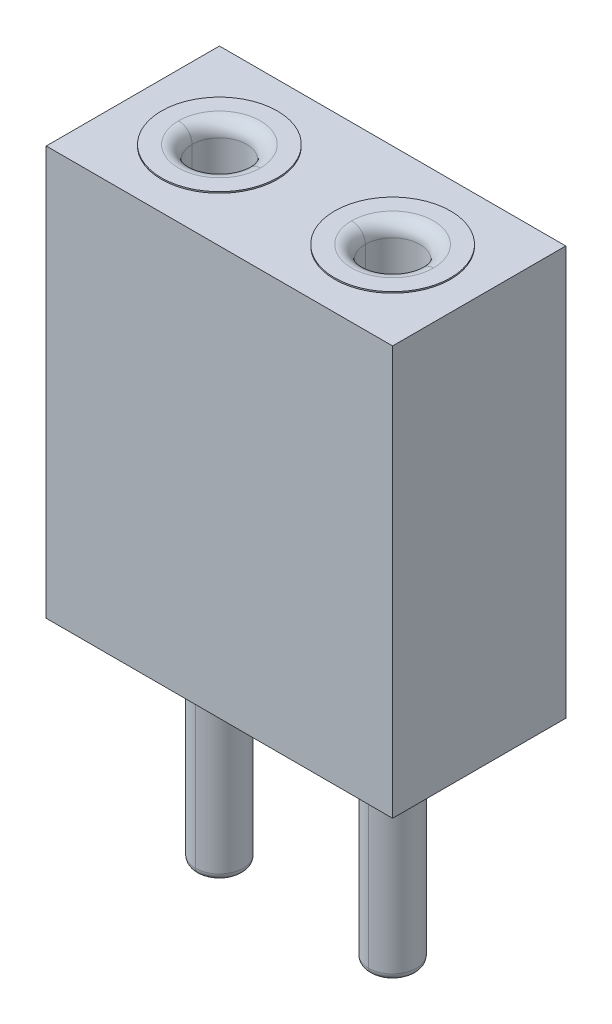
ISO-10303-21;
HEADER;
FILE_DESCRIPTION(('STEP AP214'),'2;1');
FILE_NAME('part.step','',(''),(''),'','','');
FILE_SCHEMA(('AUTOMOTIVE_DESIGN { 1 0 10303 214 1 1 1 1 }'));
ENDSEC;
DATA;
#1=APPLICATION_CONTEXT('core data for automotive mechanical design processes');
#2=APPLICATION_PROTOCOL_DEFINITION('international standard','automotive_design',2000,#1);
#3=PRODUCT_CONTEXT('',#1,'mechanical');
#4=PRODUCT('Part','Part','',(#3));
#5=PRODUCT_RELATED_PRODUCT_CATEGORY('part','',(#4));
#6=PRODUCT_DEFINITION_FORMATION('','',#4);
#7=PRODUCT_DEFINITION_CONTEXT('part definition',#1,'design');
#8=PRODUCT_DEFINITION('design','',#6,#7);
#9=PRODUCT_DEFINITION_SHAPE('','',#8);
#10=(LENGTH_UNIT() NAMED_UNIT(*) SI_UNIT(.MILLI.,.METRE.));
#11=(NAMED_UNIT(*) PLANE_ANGLE_UNIT() SI_UNIT($,.RADIAN.));
#12=(NAMED_UNIT(*) SI_UNIT($,.STERADIAN.) SOLID_ANGLE_UNIT());
#13=UNCERTAINTY_MEASURE_WITH_UNIT(LENGTH_MEASURE(1.E-05),#10,'distance_accuracy_value','');
#14=(GEOMETRIC_REPRESENTATION_CONTEXT(3) GLOBAL_UNCERTAINTY_ASSIGNED_CONTEXT((#13)) GLOBAL_UNIT_ASSIGNED_CONTEXT((#10,
#11,#12)) REPRESENTATION_CONTEXT('',''));
#15=CARTESIAN_POINT('',(0.,0.,0.));
#16=DIRECTION('',(0.,0.,1.));
#17=DIRECTION('',(1.,0.,0.));
#18=AXIS2_PLACEMENT_3D('',#15,#16,#17);
#19=CARTESIAN_POINT('',(3.81,5.82,1.27));
#20=DIRECTION('',(0.,1.,0.));
#21=DIRECTION('',(-1.,0.,0.));
#22=AXIS2_PLACEMENT_3D('',#19,#20,#21);
#23=TOROIDAL_SURFACE('',#22,0.6,0.2);
#24=CARTESIAN_POINT('',(4.41,5.82,1.27));
#25=DIRECTION('',(0.,0.,1.));
#26=DIRECTION('',(1.,0.,0.));
#27=AXIS2_PLACEMENT_3D('',#24,#25,#26);
#28=CIRCLE('',#27,0.2);
#29=CARTESIAN_POINT('',(4.41,6.02,1.27));
#30=VERTEX_POINT('',#29);
#31=CARTESIAN_POINT('',(4.21,5.82,1.27));
#32=VERTEX_POINT('',#31);
#33=EDGE_CURVE('E243',#30,#32,#28,.T.);
#34=ORIENTED_EDGE('',*,*,#33,.F.);
#35=CARTESIAN_POINT('',(3.81,6.02,1.27));
#36=DIRECTION('',(0.,-1.,0.));
#37=DIRECTION('',(-1.,0.,0.));
#38=AXIS2_PLACEMENT_3D('',#35,#36,#37);
#39=CIRCLE('',#38,0.6);
#40=CARTESIAN_POINT('',(3.21,6.02,1.27));
#41=VERTEX_POINT('',#40);
#42=EDGE_CURVE('E155',#41,#30,#39,.T.);
#43=ORIENTED_EDGE('',*,*,#42,.F.);
#44=CARTESIAN_POINT('',(3.21,5.82,1.27));
#45=DIRECTION('',(0.,0.,-1.));
#46=DIRECTION('',(-1.,0.,0.));
#47=AXIS2_PLACEMENT_3D('',#44,#45,#46);
#48=CIRCLE('',#47,0.2);
#49=CARTESIAN_POINT('',(3.41,5.82,1.27));
#50=VERTEX_POINT('',#49);
#51=EDGE_CURVE('E230',#41,#50,#48,.T.);
#52=ORIENTED_EDGE('',*,*,#51,.T.);
#53=CARTESIAN_POINT('',(3.81,5.82,1.27));
#54=DIRECTION('',(0.,1.,0.));
#55=DIRECTION('',(-1.,0.,0.));
#56=AXIS2_PLACEMENT_3D('',#53,#54,#55);
#57=CIRCLE('',#56,0.4);
#58=EDGE_CURVE('E318',#32,#50,#57,.T.);
#59=ORIENTED_EDGE('',*,*,#58,.F.);
#60=EDGE_LOOP('',(#34,#43,#52,#59));
#61=FACE_BOUND('',#60,.T.);
#62=ADVANCED_FACE('F16',(#61),#23,.T.);
#63=CARTESIAN_POINT('',(1.27,5.82,1.27));
#64=DIRECTION('',(0.,1.,0.));
#65=DIRECTION('',(-1.,0.,0.));
#66=AXIS2_PLACEMENT_3D('',#63,#64,#65);
#67=TOROIDAL_SURFACE('',#66,0.6,0.2);
#68=CARTESIAN_POINT('',(1.87,5.82,1.27));
#69=DIRECTION('',(0.,0.,1.));
#70=DIRECTION('',(1.,0.,0.));
#71=AXIS2_PLACEMENT_3D('',#68,#69,#70);
#72=CIRCLE('',#71,0.2);
#73=CARTESIAN_POINT('',(1.87,6.02,1.27));
#74=VERTEX_POINT('',#73);
#75=CARTESIAN_POINT('',(1.67,5.82,1.27));
#76=VERTEX_POINT('',#75);
#77=EDGE_CURVE('E278',#74,#76,#72,.T.);
#78=ORIENTED_EDGE('',*,*,#77,.F.);
#79=CARTESIAN_POINT('',(1.27,6.02,1.27));
#80=DIRECTION('',(0.,-1.,0.));
#81=DIRECTION('',(-1.,0.,0.));
#82=AXIS2_PLACEMENT_3D('',#79,#80,#81);
#83=CIRCLE('',#82,0.6);
#84=CARTESIAN_POINT('',(0.67,6.02,1.27));
#85=VERTEX_POINT('',#84);
#86=EDGE_CURVE('E266',#85,#74,#83,.T.);
#87=ORIENTED_EDGE('',*,*,#86,.F.);
#88=CARTESIAN_POINT('',(0.67,5.82,1.27));
#89=DIRECTION('',(0.,0.,-1.));
#90=DIRECTION('',(-1.,0.,0.));
#91=AXIS2_PLACEMENT_3D('',#88,#89,#90);
#92=CIRCLE('',#91,0.2);
#93=CARTESIAN_POINT('',(0.87,5.82,1.27));
#94=VERTEX_POINT('',#93);
#95=EDGE_CURVE('E218',#85,#94,#92,.T.);
#96=ORIENTED_EDGE('',*,*,#95,.T.);
#97=CARTESIAN_POINT('',(1.27,5.82,1.27));
#98=DIRECTION('',(0.,1.,0.));
#99=DIRECTION('',(-1.,0.,0.));
#100=AXIS2_PLACEMENT_3D('',#97,#98,#99);
#101=CIRCLE('',#100,0.4);
#102=EDGE_CURVE('E211',#76,#94,#101,.T.);
#103=ORIENTED_EDGE('',*,*,#102,.F.);
#104=EDGE_LOOP('',(#78,#87,#96,#103));
#105=FACE_BOUND('',#104,.T.);
#106=ADVANCED_FACE('F689',(#105),#67,.T.);
#107=CARTESIAN_POINT('',(1.27,3.02,1.27));
#108=DIRECTION('',(0.,1.,0.));
#109=DIRECTION('',(1.,0.,0.));
#110=AXIS2_PLACEMENT_3D('',#107,#108,#109);
#111=PLANE('',#110);
#112=CARTESIAN_POINT('',(1.27,3.02,1.27));
#113=DIRECTION('',(0.,1.,0.));
#114=DIRECTION('',(-1.,0.,0.));
#115=AXIS2_PLACEMENT_3D('',#112,#113,#114);
#116=CIRCLE('',#115,0.4);
#117=CARTESIAN_POINT('',(0.87,3.02,1.27));
#118=VERTEX_POINT('',#117);
#119=CARTESIAN_POINT('',(1.67,3.02,1.27));
#120=VERTEX_POINT('',#119);
#121=EDGE_CURVE('E11',#118,#120,#116,.T.);
#122=ORIENTED_EDGE('',*,*,#121,.T.);
#123=CARTESIAN_POINT('',(1.27,3.02,1.27));
#124=DIRECTION('',(0.,1.,0.));
#125=DIRECTION('',(-1.,0.,0.));
#126=AXIS2_PLACEMENT_3D('',#123,#124,#125);
#127=CIRCLE('',#126,0.4);
#128=EDGE_CURVE('E210',#120,#118,#127,.T.);
#129=ORIENTED_EDGE('',*,*,#128,.T.);
#130=EDGE_LOOP('',(#122,#129));
#131=FACE_BOUND('',#130,.T.);
#132=ADVANCED_FACE('F216',(#131),#111,.T.);
#133=CARTESIAN_POINT('',(1.27,3.02,1.27));
#134=DIRECTION('',(0.,1.,0.));
#135=DIRECTION('',(-1.,0.,0.));
#136=AXIS2_PLACEMENT_3D('',#133,#134,#135);
#137=CYLINDRICAL_SURFACE('',#136,0.4);
#138=DIRECTION('',(0.,1.,0.));
#139=VECTOR('',#138,1.);
#140=CARTESIAN_POINT('',(1.67,3.02,1.27));
#141=LINE('',#140,#139);
#142=EDGE_CURVE('E204',#120,#76,#141,.T.);
#143=ORIENTED_EDGE('',*,*,#142,.F.);
#144=ORIENTED_EDGE('',*,*,#121,.F.);
#145=DIRECTION('',(0.,1.,0.));
#146=VECTOR('',#145,1.);
#147=CARTESIAN_POINT('',(0.87,3.02,1.27));
#148=LINE('',#147,#146);
#149=EDGE_CURVE('E201',#118,#94,#148,.T.);
#150=ORIENTED_EDGE('',*,*,#149,.T.);
#151=CARTESIAN_POINT('',(1.27,5.82,1.27));
#152=DIRECTION('',(0.,1.,0.));
#153=DIRECTION('',(-1.,0.,0.));
#154=AXIS2_PLACEMENT_3D('',#151,#152,#153);
#155=CIRCLE('',#154,0.4);
#156=EDGE_CURVE('E226',#94,#76,#155,.T.);
#157=ORIENTED_EDGE('',*,*,#156,.T.);
#158=EDGE_LOOP('',(#143,#144,#150,#157));
#159=FACE_BOUND('',#158,.T.);
#160=ADVANCED_FACE('F199',(#159),#137,.F.);
#161=CARTESIAN_POINT('',(3.81,3.02,1.27));
#162=DIRECTION('',(0.,1.,0.));
#163=DIRECTION('',(1.,0.,0.));
#164=AXIS2_PLACEMENT_3D('',#161,#162,#163);
#165=PLANE('',#164);
#166=CARTESIAN_POINT('',(3.81,3.02,1.27));
#167=DIRECTION('',(0.,1.,0.));
#168=DIRECTION('',(-1.,0.,0.));
#169=AXIS2_PLACEMENT_3D('',#166,#167,#168);
#170=CIRCLE('',#169,0.4);
#171=CARTESIAN_POINT('',(3.41,3.02,1.27));
#172=VERTEX_POINT('',#171);
#173=CARTESIAN_POINT('',(4.21,3.02,1.27));
#174=VERTEX_POINT('',#173);
#175=EDGE_CURVE('E26',#172,#174,#170,.T.);
#176=ORIENTED_EDGE('',*,*,#175,.T.);
#177=CARTESIAN_POINT('',(3.81,3.02,1.27));
#178=DIRECTION('',(0.,1.,0.));
#179=DIRECTION('',(-1.,0.,0.));
#180=AXIS2_PLACEMENT_3D('',#177,#178,#179);
#181=CIRCLE('',#180,0.4);
#182=EDGE_CURVE('E214',#174,#172,#181,.T.);
#183=ORIENTED_EDGE('',*,*,#182,.T.);
#184=EDGE_LOOP('',(#176,#183));
#185=FACE_BOUND('',#184,.T.);
#186=ADVANCED_FACE('F536',(#185),#165,.T.);
#187=CARTESIAN_POINT('',(3.81,3.02,1.27));
#188=DIRECTION('',(0.,1.,0.));
#189=DIRECTION('',(-1.,0.,0.));
#190=AXIS2_PLACEMENT_3D('',#187,#188,#189);
#191=CYLINDRICAL_SURFACE('',#190,0.4);
#192=DIRECTION('',(0.,1.,0.));
#193=VECTOR('',#192,1.);
#194=CARTESIAN_POINT('',(4.21,3.02,1.27));
#195=LINE('',#194,#193);
#196=EDGE_CURVE('E397',#174,#32,#195,.T.);
#197=ORIENTED_EDGE('',*,*,#196,.F.);
#198=ORIENTED_EDGE('',*,*,#175,.F.);
#199=DIRECTION('',(0.,1.,0.));
#200=VECTOR('',#199,1.);
#201=CARTESIAN_POINT('',(3.41,3.02,1.27));
#202=LINE('',#201,#200);
#203=EDGE_CURVE('E314',#172,#50,#202,.T.);
#204=ORIENTED_EDGE('',*,*,#203,.T.);
#205=CARTESIAN_POINT('',(3.81,5.82,1.27));
#206=DIRECTION('',(0.,1.,0.));
#207=DIRECTION('',(-1.,0.,0.));
#208=AXIS2_PLACEMENT_3D('',#205,#206,#207);
#209=CIRCLE('',#208,0.4);
#210=EDGE_CURVE('E247',#50,#32,#209,.T.);
#211=ORIENTED_EDGE('',*,*,#210,.T.);
#212=EDGE_LOOP('',(#197,#198,#204,#211));
#213=FACE_BOUND('',#212,.T.);
#214=ADVANCED_FACE('F580',(#213),#191,.F.);
#215=CARTESIAN_POINT('',(1.27,6.02,1.27));
#216=DIRECTION('',(0.,1.,0.));
#217=DIRECTION('',(1.,0.,0.));
#218=AXIS2_PLACEMENT_3D('',#215,#216,#217);
#219=PLANE('',#218);
#220=CARTESIAN_POINT('',(1.27,6.02,1.27));
#221=DIRECTION('',(0.,1.,0.));
#222=DIRECTION('',(-1.,0.,0.));
#223=AXIS2_PLACEMENT_3D('',#220,#221,#222);
#224=CIRCLE('',#223,0.85);
#225=CARTESIAN_POINT('',(2.12,6.02,1.27));
#226=VERTEX_POINT('',#225);
#227=CARTESIAN_POINT('',(0.42,6.02,1.27));
#228=VERTEX_POINT('',#227);
#229=EDGE_CURVE('E263',#226,#228,#224,.T.);
#230=ORIENTED_EDGE('',*,*,#229,.T.);
#231=CARTESIAN_POINT('',(1.27,6.02,1.27));
#232=DIRECTION('',(0.,1.,0.));
#233=DIRECTION('',(-1.,0.,0.));
#234=AXIS2_PLACEMENT_3D('',#231,#232,#233);
#235=CIRCLE('',#234,0.85);
#236=EDGE_CURVE('E317',#228,#226,#235,.T.);
#237=ORIENTED_EDGE('',*,*,#236,.T.);
#238=EDGE_LOOP('',(#230,#237));
#239=FACE_BOUND('',#238,.T.);
#240=ORIENTED_EDGE('',*,*,#86,.T.);
#241=CARTESIAN_POINT('',(1.27,6.02,1.27));
#242=DIRECTION('',(0.,-1.,0.));
#243=DIRECTION('',(-1.,0.,0.));
#244=AXIS2_PLACEMENT_3D('',#241,#242,#243);
#245=CIRCLE('',#244,0.6);
#246=EDGE_CURVE('E282',#74,#85,#245,.T.);
#247=ORIENTED_EDGE('',*,*,#246,.T.);
#248=EDGE_LOOP('',(#240,#247));
#249=FACE_BOUND('',#248,.T.);
#250=ADVANCED_FACE('F442',(#239,#249),#219,.T.);
#251=CARTESIAN_POINT('',(1.27,6.02,1.27));
#252=DIRECTION('',(0.,-1.,0.));
#253=DIRECTION('',(1.,0.,0.));
#254=AXIS2_PLACEMENT_3D('',#251,#252,#253);
#255=CYLINDRICAL_SURFACE('',#254,0.85);
#256=DIRECTION('',(0.,-1.,0.));
#257=VECTOR('',#256,1.);
#258=CARTESIAN_POINT('',(0.42,6.02,1.27));
#259=LINE('',#258,#257);
#260=CARTESIAN_POINT('',(0.42,6.,1.27));
#261=VERTEX_POINT('',#260);
#262=EDGE_CURVE('E277',#228,#261,#259,.T.);
#263=ORIENTED_EDGE('',*,*,#262,.F.);
#264=ORIENTED_EDGE('',*,*,#229,.F.);
#265=DIRECTION('',(0.,-1.,0.));
#266=VECTOR('',#265,1.);
#267=CARTESIAN_POINT('',(2.12,6.02,1.27));
#268=LINE('',#267,#266);
#269=CARTESIAN_POINT('',(2.12,6.,1.27));
#270=VERTEX_POINT('',#269);
#271=EDGE_CURVE('E236',#226,#270,#268,.T.);
#272=ORIENTED_EDGE('',*,*,#271,.T.);
#273=CARTESIAN_POINT('',(1.27,6.,1.27));
#274=DIRECTION('',(0.,1.,0.));
#275=DIRECTION('',(1.,0.,0.));
#276=AXIS2_PLACEMENT_3D('',#273,#274,#275);
#277=CIRCLE('',#276,0.85);
#278=EDGE_CURVE('E254',#270,#261,#277,.T.);
#279=ORIENTED_EDGE('',*,*,#278,.T.);
#280=EDGE_LOOP('',(#263,#264,#272,#279));
#281=FACE_BOUND('',#280,.T.);
#282=ADVANCED_FACE('F450',(#281),#255,.T.);
#283=CARTESIAN_POINT('',(3.81,6.02,1.27));
#284=DIRECTION('',(0.,1.,0.));
#285=DIRECTION('',(1.,0.,0.));
#286=AXIS2_PLACEMENT_3D('',#283,#284,#285);
#287=PLANE('',#286);
#288=CARTESIAN_POINT('',(3.81,6.02,1.27));
#289=DIRECTION('',(0.,1.,0.));
#290=DIRECTION('',(-1.,0.,0.));
#291=AXIS2_PLACEMENT_3D('',#288,#289,#290);
#292=CIRCLE('',#291,0.85);
#293=CARTESIAN_POINT('',(4.66,6.02,1.27));
#294=VERTEX_POINT('',#293);
#295=CARTESIAN_POINT('',(2.96,6.02,1.27));
#296=VERTEX_POINT('',#295);
#297=EDGE_CURVE('E374',#294,#296,#292,.T.);
#298=ORIENTED_EDGE('',*,*,#297,.T.);
#299=CARTESIAN_POINT('',(3.81,6.02,1.27));
#300=DIRECTION('',(0.,1.,0.));
#301=DIRECTION('',(-1.,0.,0.));
#302=AXIS2_PLACEMENT_3D('',#299,#300,#301);
#303=CIRCLE('',#302,0.85);
#304=EDGE_CURVE('E231',#296,#294,#303,.T.);
#305=ORIENTED_EDGE('',*,*,#304,.T.);
#306=EDGE_LOOP('',(#298,#305));
#307=FACE_BOUND('',#306,.T.);
#308=ORIENTED_EDGE('',*,*,#42,.T.);
#309=CARTESIAN_POINT('',(3.81,6.02,1.27));
#310=DIRECTION('',(0.,-1.,0.));
#311=DIRECTION('',(-1.,0.,0.));
#312=AXIS2_PLACEMENT_3D('',#309,#310,#311);
#313=CIRCLE('',#312,0.6);
#314=EDGE_CURVE('E248',#30,#41,#313,.T.);
#315=ORIENTED_EDGE('',*,*,#314,.T.);
#316=EDGE_LOOP('',(#308,#315));
#317=FACE_BOUND('',#316,.T.);
#318=ADVANCED_FACE('F678',(#307,#317),#287,.T.);
#319=CARTESIAN_POINT('',(3.81,6.02,1.27));
#320=DIRECTION('',(0.,-1.,0.));
#321=DIRECTION('',(1.,0.,0.));
#322=AXIS2_PLACEMENT_3D('',#319,#320,#321);
#323=CYLINDRICAL_SURFACE('',#322,0.85);
#324=DIRECTION('',(0.,-1.,0.));
#325=VECTOR('',#324,1.);
#326=CARTESIAN_POINT('',(2.96,6.02,1.27));
#327=LINE('',#326,#325);
#328=CARTESIAN_POINT('',(2.96,6.,1.27));
#329=VERTEX_POINT('',#328);
#330=EDGE_CURVE('E235',#296,#329,#327,.T.);
#331=ORIENTED_EDGE('',*,*,#330,.F.);
#332=ORIENTED_EDGE('',*,*,#297,.F.);
#333=DIRECTION('',(0.,-1.,0.));
#334=VECTOR('',#333,1.);
#335=CARTESIAN_POINT('',(4.66,6.02,1.27));
#336=LINE('',#335,#334);
#337=CARTESIAN_POINT('',(4.66,6.,1.27));
#338=VERTEX_POINT('',#337);
#339=EDGE_CURVE('E242',#294,#338,#336,.T.);
#340=ORIENTED_EDGE('',*,*,#339,.T.);
#341=CARTESIAN_POINT('',(3.81,6.,1.27));
#342=DIRECTION('',(0.,1.,0.));
#343=DIRECTION('',(1.,0.,0.));
#344=AXIS2_PLACEMENT_3D('',#341,#342,#343);
#345=CIRCLE('',#344,0.85);
#346=EDGE_CURVE('E304',#338,#329,#345,.T.);
#347=ORIENTED_EDGE('',*,*,#346,.T.);
#348=EDGE_LOOP('',(#331,#332,#340,#347));
#349=FACE_BOUND('',#348,.T.);
#350=ADVANCED_FACE('F467',(#349),#323,.T.);
#351=CARTESIAN_POINT('',(3.81,-3.,1.27));
#352=DIRECTION('',(0.,-1.,0.));
#353=DIRECTION('',(0.,0.,-1.));
#354=AXIS2_PLACEMENT_3D('',#351,#352,#353);
#355=TOROIDAL_SURFACE('',#354,0.25,0.1);
#356=CARTESIAN_POINT('',(3.81,-3.,1.52));
#357=DIRECTION('',(1.,0.,0.));
#358=DIRECTION('',(0.,0.,-1.));
#359=AXIS2_PLACEMENT_3D('',#356,#357,#358);
#360=CIRCLE('',#359,0.1);
#361=CARTESIAN_POINT('',(3.81,-3.,1.62));
#362=VERTEX_POINT('',#361);
#363=CARTESIAN_POINT('',(3.81,-3.1,1.52));
#364=VERTEX_POINT('',#363);
#365=EDGE_CURVE('E241',#362,#364,#360,.T.);
#366=ORIENTED_EDGE('',*,*,#365,.F.);
#367=CARTESIAN_POINT('',(3.81,-3.,1.27));
#368=DIRECTION('',(0.,1.,0.));
#369=DIRECTION('',(0.,0.,-1.));
#370=AXIS2_PLACEMENT_3D('',#367,#368,#369);
#371=CIRCLE('',#370,0.35);
#372=CARTESIAN_POINT('',(3.81,-3.,0.92));
#373=VERTEX_POINT('',#372);
#374=EDGE_CURVE('E258',#373,#362,#371,.T.);
#375=ORIENTED_EDGE('',*,*,#374,.F.);
#376=CARTESIAN_POINT('',(3.81,-3.,1.02));
#377=DIRECTION('',(-1.,0.,0.));
#378=DIRECTION('',(0.,0.,1.));
#379=AXIS2_PLACEMENT_3D('',#376,#377,#378);
#380=CIRCLE('',#379,0.1);
#381=CARTESIAN_POINT('',(3.81,-3.1,1.02));
#382=VERTEX_POINT('',#381);
#383=EDGE_CURVE('E360',#373,#382,#380,.T.);
#384=ORIENTED_EDGE('',*,*,#383,.T.);
#385=CARTESIAN_POINT('',(3.81,-3.1,1.27));
#386=DIRECTION('',(0.,-1.,0.));
#387=DIRECTION('',(0.,0.,-1.));
#388=AXIS2_PLACEMENT_3D('',#385,#386,#387);
#389=CIRCLE('',#388,0.25);
#390=EDGE_CURVE('E261',#364,#382,#389,.T.);
#391=ORIENTED_EDGE('',*,*,#390,.F.);
#392=EDGE_LOOP('',(#366,#375,#384,#391));
#393=FACE_BOUND('',#392,.T.);
#394=ADVANCED_FACE('F656',(#393),#355,.T.);
#395=CARTESIAN_POINT('',(1.27,-3.,1.27));
#396=DIRECTION('',(0.,-1.,0.));
#397=DIRECTION('',(0.,0.,-1.));
#398=AXIS2_PLACEMENT_3D('',#395,#396,#397);
#399=TOROIDAL_SURFACE('',#398,0.25,0.1);
#400=CARTESIAN_POINT('',(1.27,-3.,1.52));
#401=DIRECTION('',(1.,0.,0.));
#402=DIRECTION('',(0.,0.,-1.));
#403=AXIS2_PLACEMENT_3D('',#400,#401,#402);
#404=CIRCLE('',#403,0.1);
#405=CARTESIAN_POINT('',(1.27,-3.,1.62));
#406=VERTEX_POINT('',#405);
#407=CARTESIAN_POINT('',(1.27,-3.1,1.52));
#408=VERTEX_POINT('',#407);
#409=EDGE_CURVE('E272',#406,#408,#404,.T.);
#410=ORIENTED_EDGE('',*,*,#409,.F.);
#411=CARTESIAN_POINT('',(1.27,-3.,1.27));
#412=DIRECTION('',(0.,1.,0.));
#413=DIRECTION('',(0.,0.,-1.));
#414=AXIS2_PLACEMENT_3D('',#411,#412,#413);
#415=CIRCLE('',#414,0.35);
#416=CARTESIAN_POINT('',(1.27,-3.,0.92));
#417=VERTEX_POINT('',#416);
#418=EDGE_CURVE('E297',#417,#406,#415,.T.);
#419=ORIENTED_EDGE('',*,*,#418,.F.);
#420=CARTESIAN_POINT('',(1.27,-3.,1.02));
#421=DIRECTION('',(-1.,0.,0.));
#422=DIRECTION('',(0.,0.,1.));
#423=AXIS2_PLACEMENT_3D('',#420,#421,#422);
#424=CIRCLE('',#423,0.1);
#425=CARTESIAN_POINT('',(1.27,-3.1,1.02));
#426=VERTEX_POINT('',#425);
#427=EDGE_CURVE('E271',#417,#426,#424,.T.);
#428=ORIENTED_EDGE('',*,*,#427,.T.);
#429=CARTESIAN_POINT('',(1.27,-3.1,1.27));
#430=DIRECTION('',(0.,-1.,0.));
#431=DIRECTION('',(0.,0.,-1.));
#432=AXIS2_PLACEMENT_3D('',#429,#430,#431);
#433=CIRCLE('',#432,0.25);
#434=EDGE_CURVE('E345',#408,#426,#433,.T.);
#435=ORIENTED_EDGE('',*,*,#434,.F.);
#436=EDGE_LOOP('',(#410,#419,#428,#435));
#437=FACE_BOUND('',#436,.T.);
#438=ADVANCED_FACE('F644',(#437),#399,.T.);
#439=CARTESIAN_POINT('',(1.27,-3.1,1.27));
#440=DIRECTION('',(0.,-1.,0.));
#441=DIRECTION('',(0.,0.,-1.));
#442=AXIS2_PLACEMENT_3D('',#439,#440,#441);
#443=PLANE('',#442);
#444=CARTESIAN_POINT('',(1.27,-3.1,1.27));
#445=DIRECTION('',(0.,-1.,0.));
#446=DIRECTION('',(0.,0.,-1.));
#447=AXIS2_PLACEMENT_3D('',#444,#445,#446);
#448=CIRCLE('',#447,0.25);
#449=EDGE_CURVE('E267',#426,#408,#448,.T.);
#450=ORIENTED_EDGE('',*,*,#449,.T.);
#451=ORIENTED_EDGE('',*,*,#434,.T.);
#452=EDGE_LOOP('',(#450,#451));
#453=FACE_BOUND('',#452,.T.);
#454=ADVANCED_FACE('F638',(#453),#443,.T.);
#455=CARTESIAN_POINT('',(1.27,-3.1,1.27));
#456=DIRECTION('',(0.,1.,0.));
#457=DIRECTION('',(0.,0.,1.));
#458=AXIS2_PLACEMENT_3D('',#455,#456,#457);
#459=CYLINDRICAL_SURFACE('',#458,0.35);
#460=DIRECTION('',(0.,1.,0.));
#461=VECTOR('',#460,1.);
#462=CARTESIAN_POINT('',(1.27,-3.1,0.92));
#463=LINE('',#462,#461);
#464=CARTESIAN_POINT('',(1.27,0.,0.92));
#465=VERTEX_POINT('',#464);
#466=EDGE_CURVE('E328',#417,#465,#463,.T.);
#467=ORIENTED_EDGE('',*,*,#466,.F.);
#468=ORIENTED_EDGE('',*,*,#418,.T.);
#469=DIRECTION('',(0.,1.,0.));
#470=VECTOR('',#469,1.);
#471=CARTESIAN_POINT('',(1.27,-3.1,1.62));
#472=LINE('',#471,#470);
#473=CARTESIAN_POINT('',(1.27,0.,1.62));
#474=VERTEX_POINT('',#473);
#475=EDGE_CURVE('E342',#406,#474,#472,.T.);
#476=ORIENTED_EDGE('',*,*,#475,.T.);
#477=CARTESIAN_POINT('',(1.27,0.,1.27));
#478=DIRECTION('',(0.,-1.,0.));
#479=DIRECTION('',(0.,0.,1.));
#480=AXIS2_PLACEMENT_3D('',#477,#478,#479);
#481=CIRCLE('',#480,0.35);
#482=EDGE_CURVE('E416',#474,#465,#481,.T.);
#483=ORIENTED_EDGE('',*,*,#482,.T.);
#484=EDGE_LOOP('',(#467,#468,#476,#483));
#485=FACE_BOUND('',#484,.T.);
#486=ADVANCED_FACE('F643',(#485),#459,.T.);
#487=CARTESIAN_POINT('',(3.81,-3.1,1.27));
#488=DIRECTION('',(0.,-1.,0.));
#489=DIRECTION('',(0.,0.,-1.));
#490=AXIS2_PLACEMENT_3D('',#487,#488,#489);
#491=PLANE('',#490);
#492=CARTESIAN_POINT('',(3.81,-3.1,1.27));
#493=DIRECTION('',(0.,-1.,0.));
#494=DIRECTION('',(0.,0.,-1.));
#495=AXIS2_PLACEMENT_3D('',#492,#493,#494);
#496=CIRCLE('',#495,0.25);
#497=EDGE_CURVE('E351',#382,#364,#496,.T.);
#498=ORIENTED_EDGE('',*,*,#497,.T.);
#499=ORIENTED_EDGE('',*,*,#390,.T.);
#500=EDGE_LOOP('',(#498,#499));
#501=FACE_BOUND('',#500,.T.);
#502=ADVANCED_FACE('F784',(#501),#491,.T.);
#503=CARTESIAN_POINT('',(3.81,-3.1,1.27));
#504=DIRECTION('',(0.,1.,0.));
#505=DIRECTION('',(0.,0.,1.));
#506=AXIS2_PLACEMENT_3D('',#503,#504,#505);
#507=CYLINDRICAL_SURFACE('',#506,0.35);
#508=DIRECTION('',(0.,1.,0.));
#509=VECTOR('',#508,1.);
#510=CARTESIAN_POINT('',(3.81,-3.1,0.92));
#511=LINE('',#510,#509);
#512=CARTESIAN_POINT('',(3.81,0.,0.92));
#513=VERTEX_POINT('',#512);
#514=EDGE_CURVE('E335',#373,#513,#511,.T.);
#515=ORIENTED_EDGE('',*,*,#514,.F.);
#516=ORIENTED_EDGE('',*,*,#374,.T.);
#517=DIRECTION('',(0.,1.,0.));
#518=VECTOR('',#517,1.);
#519=CARTESIAN_POINT('',(3.81,-3.1,1.62));
#520=LINE('',#519,#518);
#521=CARTESIAN_POINT('',(3.81,0.,1.62));
#522=VERTEX_POINT('',#521);
#523=EDGE_CURVE('E300',#362,#522,#520,.T.);
#524=ORIENTED_EDGE('',*,*,#523,.T.);
#525=CARTESIAN_POINT('',(3.81,0.,1.27));
#526=DIRECTION('',(0.,-1.,0.));
#527=DIRECTION('',(0.,0.,1.));
#528=AXIS2_PLACEMENT_3D('',#525,#526,#527);
#529=CIRCLE('',#528,0.35);
#530=EDGE_CURVE('E257',#522,#513,#529,.T.);
#531=ORIENTED_EDGE('',*,*,#530,.T.);
#532=EDGE_LOOP('',(#515,#516,#524,#531));
#533=FACE_BOUND('',#532,.T.);
#534=ADVANCED_FACE('F775',(#533),#507,.T.);
#535=CARTESIAN_POINT('',(0.,6.,0.));
#536=DIRECTION('',(0.,0.,-1.));
#537=DIRECTION('',(0.,-1.,0.));
#538=AXIS2_PLACEMENT_3D('',#535,#536,#537);
#539=PLANE('',#538);
#540=DIRECTION('',(0.,-1.,0.));
#541=VECTOR('',#540,1.);
#542=CARTESIAN_POINT('',(0.,0.,0.));
#543=LINE('',#542,#541);
#544=CARTESIAN_POINT('',(0.,6.,0.));
#545=VERTEX_POINT('',#544);
#546=CARTESIAN_POINT('',(0.,0.,0.));
#547=VERTEX_POINT('',#546);
#548=EDGE_CURVE('E331',#545,#547,#543,.T.);
#549=ORIENTED_EDGE('',*,*,#548,.F.);
#550=DIRECTION('',(-1.,0.,0.));
#551=VECTOR('',#550,1.);
#552=CARTESIAN_POINT('',(0.,6.,0.));
#553=LINE('',#552,#551);
#554=CARTESIAN_POINT('',(5.08,6.,0.));
#555=VERTEX_POINT('',#554);
#556=EDGE_CURVE('E294',#555,#545,#553,.T.);
#557=ORIENTED_EDGE('',*,*,#556,.F.);
#558=DIRECTION('',(0.,1.,0.));
#559=VECTOR('',#558,1.);
#560=CARTESIAN_POINT('',(5.08,0.,0.));
#561=LINE('',#560,#559);
#562=CARTESIAN_POINT('',(5.08,0.,0.));
#563=VERTEX_POINT('',#562);
#564=EDGE_CURVE('E283',#563,#555,#561,.T.);
#565=ORIENTED_EDGE('',*,*,#564,.F.);
#566=DIRECTION('',(1.,0.,0.));
#567=VECTOR('',#566,1.);
#568=CARTESIAN_POINT('',(0.,0.,0.));
#569=LINE('',#568,#567);
#570=EDGE_CURVE('E286',#547,#563,#569,.T.);
#571=ORIENTED_EDGE('',*,*,#570,.F.);
#572=EDGE_LOOP('',(#549,#557,#565,#571));
#573=FACE_BOUND('',#572,.T.);
#574=ADVANCED_FACE('F701',(#573),#539,.T.);
#575=CARTESIAN_POINT('',(0.,6.,2.54));
#576=DIRECTION('',(0.,0.,-1.));
#577=DIRECTION('',(0.,-1.,0.));
#578=AXIS2_PLACEMENT_3D('',#575,#576,#577);
#579=PLANE('',#578);
#580=DIRECTION('',(0.,-1.,0.));
#581=VECTOR('',#580,1.);
#582=CARTESIAN_POINT('',(0.,0.,2.54));
#583=LINE('',#582,#581);
#584=CARTESIAN_POINT('',(0.,6.,2.54));
#585=VERTEX_POINT('',#584);
#586=CARTESIAN_POINT('',(0.,0.,2.54));
#587=VERTEX_POINT('',#586);
#588=EDGE_CURVE('E39',#585,#587,#583,.T.);
#589=ORIENTED_EDGE('',*,*,#588,.T.);
#590=DIRECTION('',(1.,0.,0.));
#591=VECTOR('',#590,1.);
#592=CARTESIAN_POINT('',(0.,0.,2.54));
#593=LINE('',#592,#591);
#594=CARTESIAN_POINT('',(5.08,0.,2.54));
#595=VERTEX_POINT('',#594);
#596=EDGE_CURVE('E423',#587,#595,#593,.T.);
#597=ORIENTED_EDGE('',*,*,#596,.T.);
#598=DIRECTION('',(0.,1.,0.));
#599=VECTOR('',#598,1.);
#600=CARTESIAN_POINT('',(5.08,0.,2.54));
#601=LINE('',#600,#599);
#602=CARTESIAN_POINT('',(5.08,6.,2.54));
#603=VERTEX_POINT('',#602);
#604=EDGE_CURVE('E262',#595,#603,#601,.T.);
#605=ORIENTED_EDGE('',*,*,#604,.T.);
#606=DIRECTION('',(-1.,0.,0.));
#607=VECTOR('',#606,1.);
#608=CARTESIAN_POINT('',(0.,6.,2.54));
#609=LINE('',#608,#607);
#610=EDGE_CURVE('E249',#603,#585,#609,.T.);
#611=ORIENTED_EDGE('',*,*,#610,.T.);
#612=EDGE_LOOP('',(#589,#597,#605,#611));
#613=FACE_BOUND('',#612,.T.);
#614=ADVANCED_FACE('F696',(#613),#579,.F.);
#615=CARTESIAN_POINT('',(5.08,0.,2.54));
#616=DIRECTION('',(-1.,0.,0.));
#617=DIRECTION('',(0.,1.,0.));
#618=AXIS2_PLACEMENT_3D('',#615,#616,#617);
#619=PLANE('',#618);
#620=ORIENTED_EDGE('',*,*,#564,.T.);
#621=DIRECTION('',(0.,0.,-1.));
#622=VECTOR('',#621,1.);
#623=CARTESIAN_POINT('',(5.08,6.,2.54));
#624=LINE('',#623,#622);
#625=EDGE_CURVE('E252',#603,#555,#624,.T.);
#626=ORIENTED_EDGE('',*,*,#625,.F.);
#627=ORIENTED_EDGE('',*,*,#604,.F.);
#628=DIRECTION('',(0.,0.,-1.));
#629=VECTOR('',#628,1.);
#630=CARTESIAN_POINT('',(5.08,0.,2.54));
#631=LINE('',#630,#629);
#632=EDGE_CURVE('E290',#595,#563,#631,.T.);
#633=ORIENTED_EDGE('',*,*,#632,.T.);
#634=EDGE_LOOP('',(#620,#626,#627,#633));
#635=FACE_BOUND('',#634,.T.);
#636=ADVANCED_FACE('F629',(#635),#619,.F.);
#637=CARTESIAN_POINT('',(0.,0.,2.54));
#638=DIRECTION('',(1.,0.,0.));
#639=DIRECTION('',(0.,1.,0.));
#640=AXIS2_PLACEMENT_3D('',#637,#638,#639);
#641=PLANE('',#640);
#642=ORIENTED_EDGE('',*,*,#548,.T.);
#643=DIRECTION('',(0.,0.,-1.));
#644=VECTOR('',#643,1.);
#645=CARTESIAN_POINT('',(0.,0.,2.54));
#646=LINE('',#645,#644);
#647=EDGE_CURVE('E424',#587,#547,#646,.T.);
#648=ORIENTED_EDGE('',*,*,#647,.F.);
#649=ORIENTED_EDGE('',*,*,#588,.F.);
#650=DIRECTION('',(0.,0.,-1.));
#651=VECTOR('',#650,1.);
#652=CARTESIAN_POINT('',(0.,6.,2.54));
#653=LINE('',#652,#651);
#654=EDGE_CURVE('E253',#585,#545,#653,.T.);
#655=ORIENTED_EDGE('',*,*,#654,.T.);
#656=EDGE_LOOP('',(#642,#648,#649,#655));
#657=FACE_BOUND('',#656,.T.);
#658=ADVANCED_FACE('F624',(#657),#641,.F.);
#659=CARTESIAN_POINT('',(0.,0.,2.54));
#660=DIRECTION('',(0.,1.,0.));
#661=DIRECTION('',(1.,0.,0.));
#662=AXIS2_PLACEMENT_3D('',#659,#660,#661);
#663=PLANE('',#662);
#664=ORIENTED_EDGE('',*,*,#482,.F.);
#665=CARTESIAN_POINT('',(1.27,0.,1.27));
#666=DIRECTION('',(0.,-1.,0.));
#667=DIRECTION('',(0.,0.,1.));
#668=AXIS2_PLACEMENT_3D('',#665,#666,#667);
#669=CIRCLE('',#668,0.35);
#670=EDGE_CURVE('E382',#465,#474,#669,.T.);
#671=ORIENTED_EDGE('',*,*,#670,.F.);
#672=EDGE_LOOP('',(#664,#671));
#673=FACE_BOUND('',#672,.T.);
#674=ORIENTED_EDGE('',*,*,#570,.T.);
#675=ORIENTED_EDGE('',*,*,#632,.F.);
#676=ORIENTED_EDGE('',*,*,#596,.F.);
#677=ORIENTED_EDGE('',*,*,#647,.T.);
#678=EDGE_LOOP('',(#674,#675,#676,#677));
#679=FACE_BOUND('',#678,.T.);
#680=ORIENTED_EDGE('',*,*,#530,.F.);
#681=CARTESIAN_POINT('',(3.81,0.,1.27));
#682=DIRECTION('',(0.,-1.,0.));
#683=DIRECTION('',(0.,0.,1.));
#684=AXIS2_PLACEMENT_3D('',#681,#682,#683);
#685=CIRCLE('',#684,0.35);
#686=EDGE_CURVE('E305',#513,#522,#685,.T.);
#687=ORIENTED_EDGE('',*,*,#686,.F.);
#688=EDGE_LOOP('',(#680,#687));
#689=FACE_BOUND('',#688,.T.);
#690=ADVANCED_FACE('F457',(#673,#679,#689),#663,.F.);
#691=CARTESIAN_POINT('',(0.,6.,2.54));
#692=DIRECTION('',(0.,-1.,0.));
#693=DIRECTION('',(0.,0.,-1.));
#694=AXIS2_PLACEMENT_3D('',#691,#692,#693);
#695=PLANE('',#694);
#696=ORIENTED_EDGE('',*,*,#278,.F.);
#697=CARTESIAN_POINT('',(1.27,6.,1.27));
#698=DIRECTION('',(0.,1.,0.));
#699=DIRECTION('',(1.,0.,0.));
#700=AXIS2_PLACEMENT_3D('',#697,#698,#699);
#701=CIRCLE('',#700,0.85);
#702=EDGE_CURVE('E273',#261,#270,#701,.T.);
#703=ORIENTED_EDGE('',*,*,#702,.F.);
#704=EDGE_LOOP('',(#696,#703));
#705=FACE_BOUND('',#704,.T.);
#706=ORIENTED_EDGE('',*,*,#556,.T.);
#707=ORIENTED_EDGE('',*,*,#654,.F.);
#708=ORIENTED_EDGE('',*,*,#610,.F.);
#709=ORIENTED_EDGE('',*,*,#625,.T.);
#710=EDGE_LOOP('',(#706,#707,#708,#709));
#711=FACE_BOUND('',#710,.T.);
#712=ORIENTED_EDGE('',*,*,#346,.F.);
#713=CARTESIAN_POINT('',(3.81,6.,1.27));
#714=DIRECTION('',(0.,1.,0.));
#715=DIRECTION('',(1.,0.,0.));
#716=AXIS2_PLACEMENT_3D('',#713,#714,#715);
#717=CIRCLE('',#716,0.85);
#718=EDGE_CURVE('E348',#329,#338,#717,.T.);
#719=ORIENTED_EDGE('',*,*,#718,.F.);
#720=EDGE_LOOP('',(#712,#719));
#721=FACE_BOUND('',#720,.T.);
#722=ADVANCED_FACE('F454',(#705,#711,#721),#695,.F.);
#723=CARTESIAN_POINT('',(3.81,-3.1,1.27));
#724=DIRECTION('',(0.,1.,0.));
#725=DIRECTION('',(0.,0.,1.));
#726=AXIS2_PLACEMENT_3D('',#723,#724,#725);
#727=CYLINDRICAL_SURFACE('',#726,0.35);
#728=CARTESIAN_POINT('',(3.81,-3.,1.27));
#729=DIRECTION('',(0.,1.,0.));
#730=DIRECTION('',(0.,0.,-1.));
#731=AXIS2_PLACEMENT_3D('',#728,#729,#730);
#732=CIRCLE('',#731,0.35);
#733=EDGE_CURVE('E237',#362,#373,#732,.T.);
#734=ORIENTED_EDGE('',*,*,#733,.T.);
#735=ORIENTED_EDGE('',*,*,#514,.T.);
#736=ORIENTED_EDGE('',*,*,#686,.T.);
#737=ORIENTED_EDGE('',*,*,#523,.F.);
#738=EDGE_LOOP('',(#734,#735,#736,#737));
#739=FACE_BOUND('',#738,.T.);
#740=ADVANCED_FACE('F18',(#739),#727,.T.);
#741=CARTESIAN_POINT('',(1.27,-3.1,1.27));
#742=DIRECTION('',(0.,1.,0.));
#743=DIRECTION('',(0.,0.,1.));
#744=AXIS2_PLACEMENT_3D('',#741,#742,#743);
#745=CYLINDRICAL_SURFACE('',#744,0.35);
#746=CARTESIAN_POINT('',(1.27,-3.,1.27));
#747=DIRECTION('',(0.,1.,0.));
#748=DIRECTION('',(0.,0.,-1.));
#749=AXIS2_PLACEMENT_3D('',#746,#747,#748);
#750=CIRCLE('',#749,0.35);
#751=EDGE_CURVE('E367',#406,#417,#750,.T.);
#752=ORIENTED_EDGE('',*,*,#751,.T.);
#753=ORIENTED_EDGE('',*,*,#466,.T.);
#754=ORIENTED_EDGE('',*,*,#670,.T.);
#755=ORIENTED_EDGE('',*,*,#475,.F.);
#756=EDGE_LOOP('',(#752,#753,#754,#755));
#757=FACE_BOUND('',#756,.T.);
#758=ADVANCED_FACE('F616',(#757),#745,.T.);
#759=CARTESIAN_POINT('',(1.27,-3.,1.27));
#760=DIRECTION('',(0.,-1.,0.));
#761=DIRECTION('',(0.,0.,-1.));
#762=AXIS2_PLACEMENT_3D('',#759,#760,#761);
#763=TOROIDAL_SURFACE('',#762,0.25,0.1);
#764=ORIENTED_EDGE('',*,*,#751,.F.);
#765=ORIENTED_EDGE('',*,*,#409,.T.);
#766=ORIENTED_EDGE('',*,*,#449,.F.);
#767=ORIENTED_EDGE('',*,*,#427,.F.);
#768=EDGE_LOOP('',(#764,#765,#766,#767));
#769=FACE_BOUND('',#768,.T.);
#770=ADVANCED_FACE('F611',(#769),#763,.T.);
#771=CARTESIAN_POINT('',(3.81,-3.,1.27));
#772=DIRECTION('',(0.,-1.,0.));
#773=DIRECTION('',(0.,0.,-1.));
#774=AXIS2_PLACEMENT_3D('',#771,#772,#773);
#775=TOROIDAL_SURFACE('',#774,0.25,0.1);
#776=ORIENTED_EDGE('',*,*,#733,.F.);
#777=ORIENTED_EDGE('',*,*,#365,.T.);
#778=ORIENTED_EDGE('',*,*,#497,.F.);
#779=ORIENTED_EDGE('',*,*,#383,.F.);
#780=EDGE_LOOP('',(#776,#777,#778,#779));
#781=FACE_BOUND('',#780,.T.);
#782=ADVANCED_FACE('F573',(#781),#775,.T.);
#783=CARTESIAN_POINT('',(3.81,6.02,1.27));
#784=DIRECTION('',(0.,-1.,0.));
#785=DIRECTION('',(1.,0.,0.));
#786=AXIS2_PLACEMENT_3D('',#783,#784,#785);
#787=CYLINDRICAL_SURFACE('',#786,0.85);
#788=ORIENTED_EDGE('',*,*,#304,.F.);
#789=ORIENTED_EDGE('',*,*,#330,.T.);
#790=ORIENTED_EDGE('',*,*,#718,.T.);
#791=ORIENTED_EDGE('',*,*,#339,.F.);
#792=EDGE_LOOP('',(#788,#789,#790,#791));
#793=FACE_BOUND('',#792,.T.);
#794=ADVANCED_FACE('F470',(#793),#787,.T.);
#795=CARTESIAN_POINT('',(1.27,6.02,1.27));
#796=DIRECTION('',(0.,-1.,0.));
#797=DIRECTION('',(1.,0.,0.));
#798=AXIS2_PLACEMENT_3D('',#795,#796,#797);
#799=CYLINDRICAL_SURFACE('',#798,0.85);
#800=ORIENTED_EDGE('',*,*,#236,.F.);
#801=ORIENTED_EDGE('',*,*,#262,.T.);
#802=ORIENTED_EDGE('',*,*,#702,.T.);
#803=ORIENTED_EDGE('',*,*,#271,.F.);
#804=EDGE_LOOP('',(#800,#801,#802,#803));
#805=FACE_BOUND('',#804,.T.);
#806=ADVANCED_FACE('F447',(#805),#799,.T.);
#807=CARTESIAN_POINT('',(3.81,3.02,1.27));
#808=DIRECTION('',(0.,1.,0.));
#809=DIRECTION('',(-1.,0.,0.));
#810=AXIS2_PLACEMENT_3D('',#807,#808,#809);
#811=CYLINDRICAL_SURFACE('',#810,0.4);
#812=ORIENTED_EDGE('',*,*,#182,.F.);
#813=ORIENTED_EDGE('',*,*,#196,.T.);
#814=ORIENTED_EDGE('',*,*,#58,.T.);
#815=ORIENTED_EDGE('',*,*,#203,.F.);
#816=EDGE_LOOP('',(#812,#813,#814,#815));
#817=FACE_BOUND('',#816,.T.);
#818=ADVANCED_FACE('F562',(#817),#811,.F.);
#819=CARTESIAN_POINT('',(1.27,3.02,1.27));
#820=DIRECTION('',(0.,1.,0.));
#821=DIRECTION('',(-1.,0.,0.));
#822=AXIS2_PLACEMENT_3D('',#819,#820,#821);
#823=CYLINDRICAL_SURFACE('',#822,0.4);
#824=ORIENTED_EDGE('',*,*,#128,.F.);
#825=ORIENTED_EDGE('',*,*,#142,.T.);
#826=ORIENTED_EDGE('',*,*,#102,.T.);
#827=ORIENTED_EDGE('',*,*,#149,.F.);
#828=EDGE_LOOP('',(#824,#825,#826,#827));
#829=FACE_BOUND('',#828,.T.);
#830=ADVANCED_FACE('F209',(#829),#823,.F.);
#831=CARTESIAN_POINT('',(1.27,5.82,1.27));
#832=DIRECTION('',(0.,1.,0.));
#833=DIRECTION('',(-1.,0.,0.));
#834=AXIS2_PLACEMENT_3D('',#831,#832,#833);
#835=TOROIDAL_SURFACE('',#834,0.6,0.2);
#836=ORIENTED_EDGE('',*,*,#246,.F.);
#837=ORIENTED_EDGE('',*,*,#77,.T.);
#838=ORIENTED_EDGE('',*,*,#156,.F.);
#839=ORIENTED_EDGE('',*,*,#95,.F.);
#840=EDGE_LOOP('',(#836,#837,#838,#839));
#841=FACE_BOUND('',#840,.T.);
#842=ADVANCED_FACE('F550',(#841),#835,.T.);
#843=CARTESIAN_POINT('',(3.81,5.82,1.27));
#844=DIRECTION('',(0.,1.,0.));
#845=DIRECTION('',(-1.,0.,0.));
#846=AXIS2_PLACEMENT_3D('',#843,#844,#845);
#847=TOROIDAL_SURFACE('',#846,0.6,0.2);
#848=ORIENTED_EDGE('',*,*,#314,.F.);
#849=ORIENTED_EDGE('',*,*,#33,.T.);
#850=ORIENTED_EDGE('',*,*,#210,.F.);
#851=ORIENTED_EDGE('',*,*,#51,.F.);
#852=EDGE_LOOP('',(#848,#849,#850,#851));
#853=FACE_BOUND('',#852,.T.);
#854=ADVANCED_FACE('F545',(#853),#847,.T.);
#855=CLOSED_SHELL('',(#62,#106,#132,#160,#186,#214,#250,#282,#318,#350,#394,#438,#454,#486,#502,
#534,#574,#614,#636,#658,#690,#722,#740,#758,#770,#782,#794,#806,#818,#830,#842,#854));
#856=MANIFOLD_SOLID_BREP('B1',#855);
#857=ADVANCED_BREP_SHAPE_REPRESENTATION('',(#18,#856),#14);
#858=SHAPE_DEFINITION_REPRESENTATION(#9,#857);
ENDSEC;
END-ISO-10303-21;
